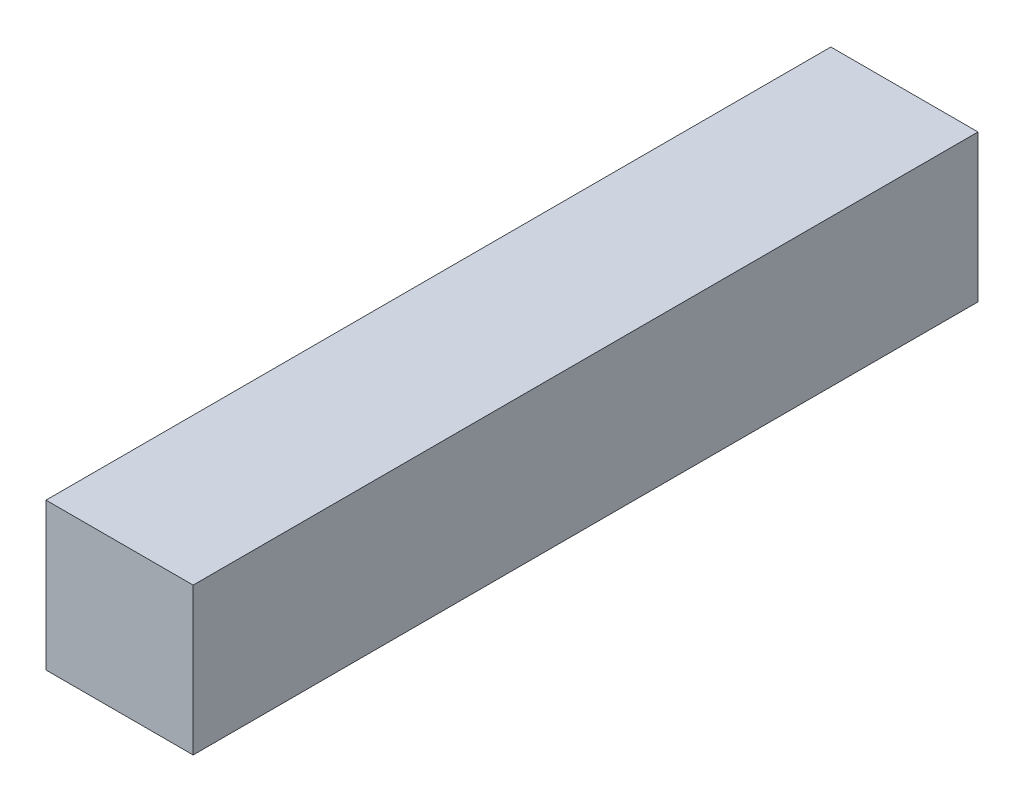
ISO-10303-21;
HEADER;
FILE_DESCRIPTION(('STEP AP214'),'2;1');
FILE_NAME('part.step','',(''),(''),'','','');
FILE_SCHEMA(('AUTOMOTIVE_DESIGN { 1 0 10303 214 1 1 1 1 }'));
ENDSEC;
DATA;
#1=APPLICATION_CONTEXT('core data for automotive mechanical design processes');
#2=APPLICATION_PROTOCOL_DEFINITION('international standard','automotive_design',2000,#1);
#3=PRODUCT_CONTEXT('',#1,'mechanical');
#4=PRODUCT('Part','Part','',(#3));
#5=PRODUCT_RELATED_PRODUCT_CATEGORY('part','',(#4));
#6=PRODUCT_DEFINITION_FORMATION('','',#4);
#7=PRODUCT_DEFINITION_CONTEXT('part definition',#1,'design');
#8=PRODUCT_DEFINITION('design','',#6,#7);
#9=PRODUCT_DEFINITION_SHAPE('','',#8);
#10=(LENGTH_UNIT() NAMED_UNIT(*) SI_UNIT(.MILLI.,.METRE.));
#11=(NAMED_UNIT(*) PLANE_ANGLE_UNIT() SI_UNIT($,.RADIAN.));
#12=(NAMED_UNIT(*) SI_UNIT($,.STERADIAN.) SOLID_ANGLE_UNIT());
#13=UNCERTAINTY_MEASURE_WITH_UNIT(LENGTH_MEASURE(1.E-05),#10,'distance_accuracy_value','');
#14=(GEOMETRIC_REPRESENTATION_CONTEXT(3) GLOBAL_UNCERTAINTY_ASSIGNED_CONTEXT((#13)) GLOBAL_UNIT_ASSIGNED_CONTEXT((#10,
#11,#12)) REPRESENTATION_CONTEXT('',''));
#15=CARTESIAN_POINT('',(0.,0.,0.));
#16=DIRECTION('',(0.,0.,1.));
#17=DIRECTION('',(1.,0.,0.));
#18=AXIS2_PLACEMENT_3D('',#15,#16,#17);
#19=CARTESIAN_POINT('',(-1.190625,-1.190625,6.34999999999999));
#20=DIRECTION('',(1.,0.,0.));
#21=DIRECTION('',(0.,1.,0.));
#22=AXIS2_PLACEMENT_3D('',#19,#20,#21);
#23=PLANE('',#22);
#24=DIRECTION('',(0.,0.,-1.));
#25=VECTOR('',#24,1.);
#26=CARTESIAN_POINT('',(-1.190625,1.190625,6.34999999999999));
#27=LINE('',#26,#25);
#28=CARTESIAN_POINT('',(-1.190625,1.190625,6.34999999999999));
#29=VERTEX_POINT('',#28);
#30=CARTESIAN_POINT('',(-1.190625,1.190625,-6.34999999999999));
#31=VERTEX_POINT('',#30);
#32=EDGE_CURVE('E104',#29,#31,#27,.T.);
#33=ORIENTED_EDGE('',*,*,#32,.T.);
#34=DIRECTION('',(0.,-1.,0.));
#35=VECTOR('',#34,1.);
#36=CARTESIAN_POINT('',(-1.190625,-1.190625,-6.34999999999999));
#37=LINE('',#36,#35);
#38=CARTESIAN_POINT('',(-1.190625,-1.190625,-6.34999999999999));
#39=VERTEX_POINT('',#38);
#40=EDGE_CURVE('E98',#31,#39,#37,.T.);
#41=ORIENTED_EDGE('',*,*,#40,.T.);
#42=DIRECTION('',(0.,0.,-1.));
#43=VECTOR('',#42,1.);
#44=CARTESIAN_POINT('',(-1.190625,-1.190625,6.34999999999999));
#45=LINE('',#44,#43);
#46=CARTESIAN_POINT('',(-1.190625,-1.190625,6.34999999999999));
#47=VERTEX_POINT('',#46);
#48=EDGE_CURVE('E11',#47,#39,#45,.T.);
#49=ORIENTED_EDGE('',*,*,#48,.F.);
#50=DIRECTION('',(0.,-1.,0.));
#51=VECTOR('',#50,1.);
#52=CARTESIAN_POINT('',(-1.190625,-1.190625,6.34999999999999));
#53=LINE('',#52,#51);
#54=EDGE_CURVE('E113',#29,#47,#53,.T.);
#55=ORIENTED_EDGE('',*,*,#54,.F.);
#56=EDGE_LOOP('',(#33,#41,#49,#55));
#57=FACE_BOUND('',#56,.T.);
#58=ADVANCED_FACE('F45',(#57),#23,.F.);
#59=CARTESIAN_POINT('',(1.190625,-1.190625,6.34999999999999));
#60=DIRECTION('',(0.,1.,0.));
#61=DIRECTION('',(0.,0.,1.));
#62=AXIS2_PLACEMENT_3D('',#59,#60,#61);
#63=PLANE('',#62);
#64=ORIENTED_EDGE('',*,*,#48,.T.);
#65=DIRECTION('',(1.,0.,0.));
#66=VECTOR('',#65,1.);
#67=CARTESIAN_POINT('',(1.190625,-1.190625,-6.34999999999999));
#68=LINE('',#67,#66);
#69=CARTESIAN_POINT('',(1.190625,-1.190625,-6.34999999999999));
#70=VERTEX_POINT('',#69);
#71=EDGE_CURVE('E88',#39,#70,#68,.T.);
#72=ORIENTED_EDGE('',*,*,#71,.T.);
#73=DIRECTION('',(0.,0.,-1.));
#74=VECTOR('',#73,1.);
#75=CARTESIAN_POINT('',(1.190625,-1.190625,6.34999999999999));
#76=LINE('',#75,#74);
#77=CARTESIAN_POINT('',(1.190625,-1.190625,6.34999999999999));
#78=VERTEX_POINT('',#77);
#79=EDGE_CURVE('E53',#78,#70,#76,.T.);
#80=ORIENTED_EDGE('',*,*,#79,.F.);
#81=DIRECTION('',(1.,0.,0.));
#82=VECTOR('',#81,1.);
#83=CARTESIAN_POINT('',(1.190625,-1.190625,6.34999999999999));
#84=LINE('',#83,#82);
#85=EDGE_CURVE('E89',#47,#78,#84,.T.);
#86=ORIENTED_EDGE('',*,*,#85,.F.);
#87=EDGE_LOOP('',(#64,#72,#80,#86));
#88=FACE_BOUND('',#87,.T.);
#89=ADVANCED_FACE('F86',(#88),#63,.F.);
#90=CARTESIAN_POINT('',(1.190625,1.190625,6.34999999999999));
#91=DIRECTION('',(-1.,0.,0.));
#92=DIRECTION('',(0.,-1.,0.));
#93=AXIS2_PLACEMENT_3D('',#90,#91,#92);
#94=PLANE('',#93);
#95=ORIENTED_EDGE('',*,*,#79,.T.);
#96=DIRECTION('',(0.,1.,0.));
#97=VECTOR('',#96,1.);
#98=CARTESIAN_POINT('',(1.190625,1.190625,-6.34999999999999));
#99=LINE('',#98,#97);
#100=CARTESIAN_POINT('',(1.190625,1.190625,-6.34999999999999));
#101=VERTEX_POINT('',#100);
#102=EDGE_CURVE('E101',#70,#101,#99,.T.);
#103=ORIENTED_EDGE('',*,*,#102,.T.);
#104=DIRECTION('',(0.,0.,-1.));
#105=VECTOR('',#104,1.);
#106=CARTESIAN_POINT('',(1.190625,1.190625,6.34999999999999));
#107=LINE('',#106,#105);
#108=CARTESIAN_POINT('',(1.190625,1.190625,6.34999999999999));
#109=VERTEX_POINT('',#108);
#110=EDGE_CURVE('E124',#109,#101,#107,.T.);
#111=ORIENTED_EDGE('',*,*,#110,.F.);
#112=DIRECTION('',(0.,1.,0.));
#113=VECTOR('',#112,1.);
#114=CARTESIAN_POINT('',(1.190625,1.190625,6.34999999999999));
#115=LINE('',#114,#113);
#116=EDGE_CURVE('E65',#78,#109,#115,.T.);
#117=ORIENTED_EDGE('',*,*,#116,.F.);
#118=EDGE_LOOP('',(#95,#103,#111,#117));
#119=FACE_BOUND('',#118,.T.);
#120=ADVANCED_FACE('F128',(#119),#94,.F.);
#121=CARTESIAN_POINT('',(-1.190625,1.190625,6.34999999999999));
#122=DIRECTION('',(0.,-1.,0.));
#123=DIRECTION('',(0.,0.,-1.));
#124=AXIS2_PLACEMENT_3D('',#121,#122,#123);
#125=PLANE('',#124);
#126=ORIENTED_EDGE('',*,*,#110,.T.);
#127=DIRECTION('',(-1.,0.,0.));
#128=VECTOR('',#127,1.);
#129=CARTESIAN_POINT('',(-1.190625,1.190625,-6.34999999999999));
#130=LINE('',#129,#128);
#131=EDGE_CURVE('E110',#101,#31,#130,.T.);
#132=ORIENTED_EDGE('',*,*,#131,.T.);
#133=ORIENTED_EDGE('',*,*,#32,.F.);
#134=DIRECTION('',(-1.,0.,0.));
#135=VECTOR('',#134,1.);
#136=CARTESIAN_POINT('',(-1.190625,1.190625,6.34999999999999));
#137=LINE('',#136,#135);
#138=EDGE_CURVE('E60',#109,#29,#137,.T.);
#139=ORIENTED_EDGE('',*,*,#138,.F.);
#140=EDGE_LOOP('',(#126,#132,#133,#139));
#141=FACE_BOUND('',#140,.T.);
#142=ADVANCED_FACE('F130',(#141),#125,.F.);
#143=CARTESIAN_POINT('',(0.,0.,6.34999999999999));
#144=DIRECTION('',(0.,0.,-1.));
#145=DIRECTION('',(-1.,0.,0.));
#146=AXIS2_PLACEMENT_3D('',#143,#144,#145);
#147=PLANE('',#146);
#148=ORIENTED_EDGE('',*,*,#54,.T.);
#149=ORIENTED_EDGE('',*,*,#85,.T.);
#150=ORIENTED_EDGE('',*,*,#116,.T.);
#151=ORIENTED_EDGE('',*,*,#138,.T.);
#152=EDGE_LOOP('',(#148,#149,#150,#151));
#153=FACE_BOUND('',#152,.T.);
#154=ADVANCED_FACE('F131',(#153),#147,.F.);
#155=CARTESIAN_POINT('',(0.,0.,-6.34999999999999));
#156=DIRECTION('',(0.,0.,-1.));
#157=DIRECTION('',(-1.,0.,0.));
#158=AXIS2_PLACEMENT_3D('',#155,#156,#157);
#159=PLANE('',#158);
#160=ORIENTED_EDGE('',*,*,#40,.F.);
#161=ORIENTED_EDGE('',*,*,#131,.F.);
#162=ORIENTED_EDGE('',*,*,#102,.F.);
#163=ORIENTED_EDGE('',*,*,#71,.F.);
#164=EDGE_LOOP('',(#160,#161,#162,#163));
#165=FACE_BOUND('',#164,.T.);
#166=ADVANCED_FACE('F96',(#165),#159,.T.);
#167=CLOSED_SHELL('',(#58,#89,#120,#142,#154,#166));
#168=MANIFOLD_SOLID_BREP('B2',#167);
#169=ADVANCED_BREP_SHAPE_REPRESENTATION('',(#18,#168),#14);
#170=SHAPE_DEFINITION_REPRESENTATION(#9,#169);
ENDSEC;
END-ISO-10303-21;
